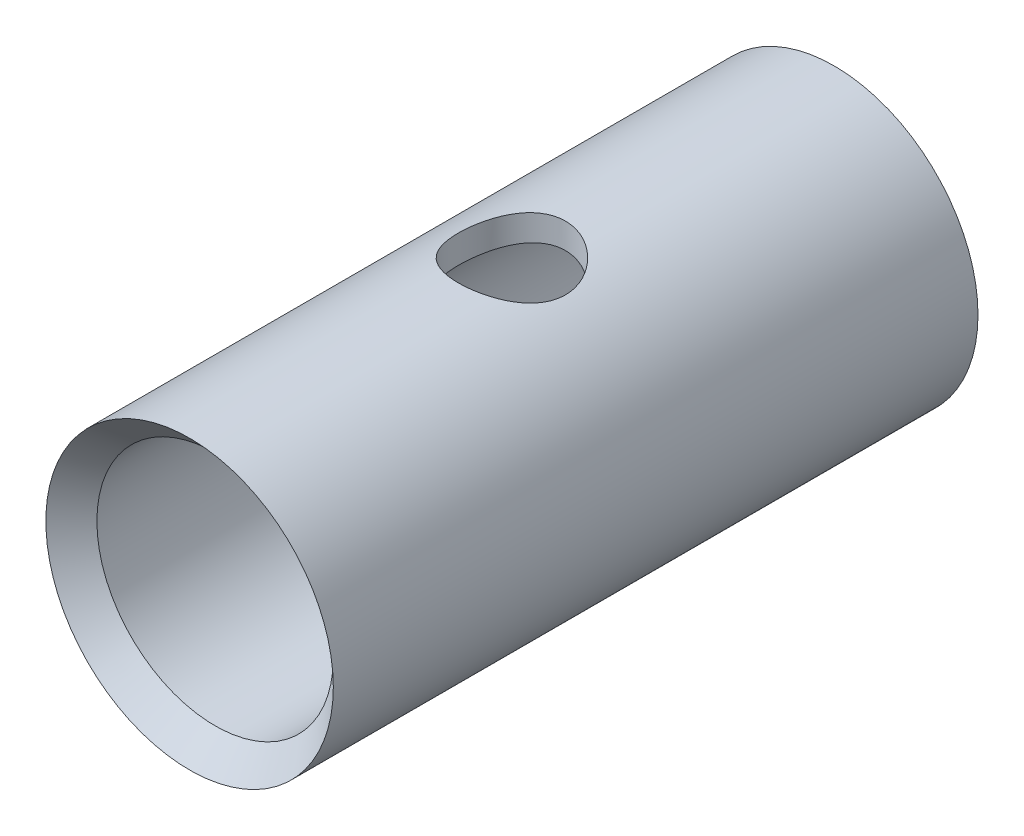
ISO-10303-21;
HEADER;
FILE_DESCRIPTION(('STEP AP214'),'2;1');
FILE_NAME('part.step','',(''),(''),'','','');
FILE_SCHEMA(('AUTOMOTIVE_DESIGN { 1 0 10303 214 1 1 1 1 }'));
ENDSEC;
DATA;
#1=APPLICATION_CONTEXT('core data for automotive mechanical design processes');
#2=APPLICATION_PROTOCOL_DEFINITION('international standard','automotive_design',2000,#1);
#3=PRODUCT_CONTEXT('',#1,'mechanical');
#4=PRODUCT('Part','Part','',(#3));
#5=PRODUCT_RELATED_PRODUCT_CATEGORY('part','',(#4));
#6=PRODUCT_DEFINITION_FORMATION('','',#4);
#7=PRODUCT_DEFINITION_CONTEXT('part definition',#1,'design');
#8=PRODUCT_DEFINITION('design','',#6,#7);
#9=PRODUCT_DEFINITION_SHAPE('','',#8);
#10=(LENGTH_UNIT() NAMED_UNIT(*) SI_UNIT(.MILLI.,.METRE.));
#11=(NAMED_UNIT(*) PLANE_ANGLE_UNIT() SI_UNIT($,.RADIAN.));
#12=(NAMED_UNIT(*) SI_UNIT($,.STERADIAN.) SOLID_ANGLE_UNIT());
#13=UNCERTAINTY_MEASURE_WITH_UNIT(LENGTH_MEASURE(1.E-05),#10,'distance_accuracy_value','');
#14=(GEOMETRIC_REPRESENTATION_CONTEXT(3) GLOBAL_UNCERTAINTY_ASSIGNED_CONTEXT((#13)) GLOBAL_UNIT_ASSIGNED_CONTEXT((#10,
#11,#12)) REPRESENTATION_CONTEXT('',''));
#15=CARTESIAN_POINT('',(0.,0.,0.));
#16=DIRECTION('',(0.,0.,1.));
#17=DIRECTION('',(1.,0.,0.));
#18=AXIS2_PLACEMENT_3D('',#15,#16,#17);
#19=CARTESIAN_POINT('',(0.,0.,37.9));
#20=DIRECTION('',(0.,0.,-1.));
#21=DIRECTION('',(-1.,0.,0.));
#22=AXIS2_PLACEMENT_3D('',#19,#20,#21);
#23=CYLINDRICAL_SURFACE('',#22,16.9);
#24=CARTESIAN_POINT('',(0.,16.9,6.3));
#25=CARTESIAN_POINT('',(-0.170621168013646,16.9000005495255,6.30000075229979));
#26=CARTESIAN_POINT('',(-0.341231905718225,16.8974105634237,6.29306339765766));
#27=CARTESIAN_POINT('',(-0.681236562405918,16.8871207820205,6.26538229568174));
#28=CARTESIAN_POINT('',(-0.850630047616662,16.8794192484132,6.24463385154478));
#29=CARTESIAN_POINT('',(-1.18679747227653,16.8591179028863,6.18954843388442));
#30=CARTESIAN_POINT('',(-1.35357274835379,16.8465206808765,6.15521864497196));
#31=CARTESIAN_POINT('',(-1.68347849426379,16.8167578248736,6.07328575068739));
#32=CARTESIAN_POINT('',(-1.84660752168567,16.7995904164659,6.02567748949004));
#33=CARTESIAN_POINT('',(-2.16767537294611,16.7611833077502,5.91775304746544));
#34=CARTESIAN_POINT('',(-2.32562546063216,16.7399532418655,5.85746689891143));
#35=CARTESIAN_POINT('',(-2.63579350467232,16.6939266086243,5.72460208101528));
#36=CARTESIAN_POINT('',(-2.78800931016346,16.6691287194992,5.65201885420729));
#37=CARTESIAN_POINT('',(-3.08571899465927,16.6165936824224,5.49514741364249));
#38=CARTESIAN_POINT('',(-3.23121388205003,16.5888569774721,5.41086096345324));
#39=CARTESIAN_POINT('',(-3.51473842709239,16.5311087146713,5.23113731919624));
#40=CARTESIAN_POINT('',(-3.6527653643097,16.50109633727,5.13569610113537));
#41=CARTESIAN_POINT('',(-3.92561005398422,16.4383671214281,4.93049811152152));
#42=CARTESIAN_POINT('',(-4.06011025041513,16.4055909683688,4.82033708767414));
#43=CARTESIAN_POINT('',(-4.3194459659585,16.3392259897144,4.58939391893625));
#44=CARTESIAN_POINT('',(-4.44428120665652,16.305637140745,4.46861146829253));
#45=CARTESIAN_POINT('',(-4.68362175921436,16.2385080694037,4.21708870220941));
#46=CARTESIAN_POINT('',(-4.79812232272719,16.2049678762807,4.08634385983885));
#47=CARTESIAN_POINT('',(-5.01600286755679,16.1388560588966,3.81574110252527));
#48=CARTESIAN_POINT('',(-5.11938659611052,16.1062841109573,3.6758862840384));
#49=CARTESIAN_POINT('',(-5.31812475084001,16.0417853857861,3.38232881986174));
#50=CARTESIAN_POINT('',(-5.41302406579179,16.0099302987466,3.22830176323067));
#51=CARTESIAN_POINT('',(-5.58940536606466,15.9492084036354,2.91226389501302));
#52=CARTESIAN_POINT('',(-5.6708927268506,15.920340400082,2.75025631598511));
#53=CARTESIAN_POINT('',(-5.81980942101562,15.8665085181469,2.41924696276032));
#54=CARTESIAN_POINT('',(-5.88723706164311,15.8415451099579,2.25024434931289));
#55=CARTESIAN_POINT('',(-6.00734722079026,15.79638884205,1.90654103845655));
#56=CARTESIAN_POINT('',(-6.06003682868019,15.7761936894095,1.73184312594368));
#57=CARTESIAN_POINT('',(-6.14834203709004,15.7419834333421,1.38513285493304));
#58=CARTESIAN_POINT('',(-6.18455895410029,15.7277524962012,1.21329493554901));
#59=CARTESIAN_POINT('',(-6.24253949028409,15.7048297117606,0.866903195015808));
#60=CARTESIAN_POINT('',(-6.26430941300662,15.6961354487522,0.692350592413399));
#61=CARTESIAN_POINT('',(-6.29317407342909,15.6845848821698,0.341868189277755));
#62=CARTESIAN_POINT('',(-6.30027093619383,15.6817277332211,0.165938591876598));
#63=CARTESIAN_POINT('',(-6.29971326789152,15.6819518669563,-0.185889958429555));
#64=CARTESIAN_POINT('',(-6.29205929959284,15.685032923088,-0.361788912247602));
#65=CARTESIAN_POINT('',(-6.26298083563819,15.6966650714368,-0.701731281724682));
#66=CARTESIAN_POINT('',(-6.24239982194643,15.7048809661134,-0.865859199475245));
#67=CARTESIAN_POINT('',(-6.18846142072574,15.7262133319127,-1.1917337553841));
#68=CARTESIAN_POINT('',(-6.15509978679452,15.7393314317735,-1.35347958351748));
#69=CARTESIAN_POINT('',(-6.07592473598682,15.7700646132966,-1.67340646056008));
#70=CARTESIAN_POINT('',(-6.03011455624527,15.7876785257901,-1.83158842465659));
#71=CARTESIAN_POINT('',(-5.92641928170079,15.8268956225991,-2.14349630241259));
#72=CARTESIAN_POINT('',(-5.86852956995387,15.8485003318821,-2.29722048659227));
#73=CARTESIAN_POINT('',(-5.73997571940507,15.8955165279266,-2.60202578724681));
#74=CARTESIAN_POINT('',(-5.66909631551509,15.9209906924915,-2.75300637079496));
#75=CARTESIAN_POINT('',(-5.51580925919303,15.9747439327848,-3.04853543199206));
#76=CARTESIAN_POINT('',(-5.43339768750958,16.003023961142,-3.1930817008085));
#77=CARTESIAN_POINT('',(-5.25761056369151,16.0616348172727,-3.47492719040059));
#78=CARTESIAN_POINT('',(-5.16423380704993,16.0919658701923,-3.61222561260686));
#79=CARTESIAN_POINT('',(-4.96709413933563,16.153905090977,-3.8788486790437));
#80=CARTESIAN_POINT('',(-4.8633307646408,16.185513315813,-4.00817296692023));
#81=CARTESIAN_POINT('',(-4.6387637276969,16.2513523859425,-4.2665065801102));
#82=CARTESIAN_POINT('',(-4.51728546497176,16.2856177143405,-4.39492148847767));
#83=CARTESIAN_POINT('',(-4.26395985965752,16.3537715347372,-4.64110255701562));
#84=CARTESIAN_POINT('',(-4.13211568069296,16.3876601381342,-4.75887194273811));
#85=CARTESIAN_POINT('',(-3.85872870626401,16.4541791219461,-4.98311994756249));
#86=CARTESIAN_POINT('',(-3.71718081527205,16.4868088270266,-5.08959255867709));
#87=CARTESIAN_POINT('',(-3.42534900798332,16.5499020826645,-5.29040106990669));
#88=CARTESIAN_POINT('',(-3.27506860728443,16.5803664941098,-5.38474180568226));
#89=CARTESIAN_POINT('',(-2.96423215771626,16.6387715408498,-5.56199896763376));
#90=CARTESIAN_POINT('',(-2.80355232547099,16.6666653568901,-5.64471407303524));
#91=CARTESIAN_POINT('',(-2.47521994258615,16.7185793381941,-5.79620212055356));
#92=CARTESIAN_POINT('',(-2.30757018700197,16.742601037748,-5.86498058772452));
#93=CARTESIAN_POINT('',(-1.96646075877162,16.7860830927623,-5.98797935824775));
#94=CARTESIAN_POINT('',(-1.79300194973094,16.8055441228265,-6.04220181486445));
#95=CARTESIAN_POINT('',(-1.44157945945188,16.8393289354646,-6.13554358845206));
#96=CARTESIAN_POINT('',(-1.26361604493125,16.8536530214389,-6.17466379740856));
#97=CARTESIAN_POINT('',(-0.914075290767235,16.8761223925919,-6.2357250816541));
#98=CARTESIAN_POINT('',(-0.74265502091892,16.8845532766444,-6.25846217302362));
#99=CARTESIAN_POINT('',(-0.398351442297092,16.8961824206641,-6.28976894738468));
#100=CARTESIAN_POINT('',(-0.225468194127639,16.8993808963283,-6.29833921437894));
#101=CARTESIAN_POINT('',(0.120399989853772,16.900455799623,-6.30122270947712));
#102=CARTESIAN_POINT('',(0.293384900254129,16.8983332335502,-6.29553863331205));
#103=CARTESIAN_POINT('',(0.638155088316055,16.8888275416577,-6.26997899429614));
#104=CARTESIAN_POINT('',(0.809940383820353,16.8814444942499,-6.25010364297821));
#105=CARTESIAN_POINT('',(1.14450128279663,16.8620022712354,-6.19739412985697));
#106=CARTESIAN_POINT('',(1.30737068189106,16.8501321124307,-6.16508293404881));
#107=CARTESIAN_POINT('',(1.62974833286344,16.8220126350691,-6.08780782267223));
#108=CARTESIAN_POINT('',(1.78925545814379,16.8057618730822,-6.04283973638109));
#109=CARTESIAN_POINT('',(2.10377857952379,16.7692926465133,-5.940660836668));
#110=CARTESIAN_POINT('',(2.25879578421814,16.7490752612729,-5.88345335327629));
#111=CARTESIAN_POINT('',(2.56349754307563,16.7051544723797,-5.75722906103647));
#112=CARTESIAN_POINT('',(2.7131800471032,16.6814497461036,-5.68820777000443));
#113=CARTESIAN_POINT('',(3.01052803784591,16.6303977595915,-5.53672823505879));
#114=CARTESIAN_POINT('',(3.15801047984873,16.6029650846885,-5.45393954386419));
#115=CARTESIAN_POINT('',(3.44555895098632,16.545683014114,-5.27699102049225));
#116=CARTESIAN_POINT('',(3.58562240781198,16.5158327891853,-5.1828272810055));
#117=CARTESIAN_POINT('',(3.85753220496953,16.4544485170715,-4.98375766240632));
#118=CARTESIAN_POINT('',(3.98937735673048,16.4229142275478,-4.87885023526176));
#119=CARTESIAN_POINT('',(4.24412514234555,16.3589319163027,-4.65893968682675));
#120=CARTESIAN_POINT('',(4.36702745452576,16.3264838617712,-4.54393620270916));
#121=CARTESIAN_POINT('',(4.61002992069146,16.2595943112867,-4.29758710332736));
#122=CARTESIAN_POINT('',(4.72956146417505,16.2251455909822,-4.16568183650315));
#123=CARTESIAN_POINT('',(4.9570956452551,16.1570821588875,-3.89215124981191));
#124=CARTESIAN_POINT('',(5.06510197327663,16.1234671827909,-3.75052906535413));
#125=CARTESIAN_POINT('',(5.26896215469136,16.0580044835236,-3.45829321053491));
#126=CARTESIAN_POINT('',(5.36480996658997,16.0261576433143,-3.30767512440993));
#127=CARTESIAN_POINT('',(5.54354893017009,15.9652116018421,-2.9984890176261));
#128=CARTESIAN_POINT('',(5.62644552884903,15.9361112475172,-2.83992437637628));
#129=CARTESIAN_POINT('',(5.77897583313075,15.8814367993584,-2.51510728621974));
#130=CARTESIAN_POINT('',(5.8485519998778,15.8558781297498,-2.34882517617697));
#131=CARTESIAN_POINT('',(5.97333691077132,15.8092911037657,-2.01041129278817));
#132=CARTESIAN_POINT('',(6.0285516653825,15.7882608528162,-1.83828200078615));
#133=CARTESIAN_POINT('',(6.12407361068238,15.7514553617766,-1.48943476950954));
#134=CARTESIAN_POINT('',(6.16438521236666,15.7356785669203,-1.31271820456311));
#135=CARTESIAN_POINT('',(6.22967178864632,15.7099467418598,-0.95605923196206));
#136=CARTESIAN_POINT('',(6.25464781521971,15.6999913123284,-0.77611704644778));
#137=CARTESIAN_POINT('',(6.28787989818049,15.6867097020635,-0.426019076306181));
#138=CARTESIAN_POINT('',(6.29709799540585,15.6830022980239,-0.255968423890921));
#139=CARTESIAN_POINT('',(6.30173317812632,15.6811404939853,0.0843494825246638));
#140=CARTESIAN_POINT('',(6.29715071399093,15.6829859127745,0.254616729275361));
#141=CARTESIAN_POINT('',(6.27423571586757,15.6921673654412,0.594054721342498));
#142=CARTESIAN_POINT('',(6.255904492561,15.6995028759432,0.763225569629114));
#143=CARTESIAN_POINT('',(6.20568730295427,15.7194202425393,1.09922709338117));
#144=CARTESIAN_POINT('',(6.17380134227905,15.7320020964563,1.2660577698177));
#145=CARTESIAN_POINT('',(6.09795452274454,15.7615529563653,1.59121957002708));
#146=CARTESIAN_POINT('',(6.05438546979896,15.7783787073944,1.74965543912415));
#147=CARTESIAN_POINT('',(5.95516730061994,15.8160929966394,2.06225251622011));
#148=CARTESIAN_POINT('',(5.89951420387523,15.8369828733511,2.21641229675051));
#149=CARTESIAN_POINT('',(5.77658782093709,15.8822327783029,2.51947637486521));
#150=CARTESIAN_POINT('',(5.70931628169858,15.9065922847514,2.66838145850051));
#151=CARTESIAN_POINT('',(5.56364074641075,15.9581286436169,2.96015652799162));
#152=CARTESIAN_POINT('',(5.48523272411245,15.985306514013,3.10302430679393));
#153=CARTESIAN_POINT('',(5.22542152465476,16.0729435614781,3.53579426358685));
#154=CARTESIAN_POINT('',(5.02573208561014,16.1370755843635,3.81424024778072));
#155=CARTESIAN_POINT('',(4.58427144385223,16.2679831571681,4.33485983733904));
#156=CARTESIAN_POINT('',(4.34248694731324,16.3347595370261,4.57702193898946));
#157=CARTESIAN_POINT('',(3.94563325234357,16.4335628609549,4.9147111667876));
#158=CARTESIAN_POINT('',(3.80361543993247,16.4670917745851,5.02543332275901));
#159=CARTESIAN_POINT('',(3.51032978967127,16.5320931427295,5.23449870446372));
#160=CARTESIAN_POINT('',(3.35906542969165,16.5635663613429,5.33284654245311));
#161=CARTESIAN_POINT('',(3.04814500961123,16.6235946259716,5.51646930711526));
#162=CARTESIAN_POINT('',(2.88848467398469,16.6521481629589,5.601737484881));
#163=CARTESIAN_POINT('',(2.56196843371789,16.705498050936,5.75839283700686));
#164=CARTESIAN_POINT('',(2.39511562819453,16.7302959997644,5.82978591829691));
#165=CARTESIAN_POINT('',(2.04875352068437,16.7763014133154,5.96055233029704));
#166=CARTESIAN_POINT('',(1.86900430138347,16.7973328878215,6.01935389408757));
#167=CARTESIAN_POINT('',(1.50441157260641,16.8339035649305,6.12066527150767));
#168=CARTESIAN_POINT('',(1.31956783312357,16.8494425191187,6.16317434827057));
#169=CARTESIAN_POINT('',(0.946477196300018,16.8745109857018,6.23138251903347));
#170=CARTESIAN_POINT('',(0.758231719065533,16.8840429487932,6.25708846843277));
#171=CARTESIAN_POINT('',(0.379986391707063,16.8967868150662,6.29139588363098));
#172=CARTESIAN_POINT('',(0.189986729671972,16.8999993881032,6.29999916231393));
#173=CARTESIAN_POINT('',(0.,16.9,6.3));
#174=B_SPLINE_CURVE_WITH_KNOTS('',3,(#24,#25,#26,#27,#28,#29,#30,#31,#32,#33,#34,#35,#36,#37,
#38,#39,#40,#41,#42,#43,#44,#45,#46,#47,#48,#49,#50,#51,#52,#53,#54,#55,#56,#57,#58,#59,#60,#61,
#62,#63,#64,#65,#66,#67,#68,#69,#70,#71,#72,#73,#74,#75,#76,#77,#78,#79,#80,#81,#82,#83,#84,#85,
#86,#87,#88,#89,#90,#91,#92,#93,#94,#95,#96,#97,#98,#99,#100,#101,#102,#103,#104,#105,#106,#107,
#108,#109,#110,#111,#112,#113,#114,#115,#116,#117,#118,#119,#120,#121,#122,#123,#124,#125,#126,
#127,#128,#129,#130,#131,#132,#133,#134,#135,#136,#137,#138,#139,#140,#141,#142,#143,#144,#145,
#146,#147,#148,#149,#150,#151,#152,#153,#154,#155,#156,#157,#158,#159,#160,#161,#162,#163,#164,
#165,#166,#167,#168,#169,#170,#171,#172,#173),.UNSPECIFIED.,.T.,.F.,(4,2,2,2,2,2,2,2,2,2,2,2,2,
2,2,2,2,2,2,2,2,2,2,2,2,2,2,2,2,2,2,2,2,2,2,2,2,2,2,2,2,2,2,2,2,2,2,2,2,2,2,2,2,2,2,2,2,2,2,2,2,
2,2,2,2,2,2,2,2,2,2,2,2,2,4),(0.,0.511685719119617,1.02354553860795,1.53513494255571,
2.04692326595268,2.55751261713712,3.06829161535466,3.57899372726423,4.08988064283557,
4.62004275321381,5.15022013007766,5.68063987403637,6.21088026113594,6.76129352798836,
7.31148565105759,7.86174397754394,8.41173715873816,8.93961676211489,9.46726588802973,
9.99483859040696,10.5223911654199,11.0186607860346,11.5150954370371,12.0114011179026,
12.5078968414419,13.0135194470691,13.5193143097091,14.0251647851214,14.5310378499972,
15.0705967195231,15.609991552937,16.1496718308821,16.6891363257498,17.2370218274591,
17.7846896981245,18.3322765078155,18.8798309703804,19.3985576635092,19.9172629724977,
20.4358701931686,20.9544696837234,21.4532967728799,21.9522884293197,22.4511444950137,
22.9501902490119,23.4636460994575,23.9772788253109,24.4909856636743,25.0047109709456,
25.548010065938,26.0911346687982,26.6345280986399,27.1776923702507,27.7231524202234,
28.268383818387,28.8134537109687,29.3584862090859,29.8688676080478,30.3792323513304,
30.8895484472733,31.3998643314459,31.8948393102601,32.3899775829698,32.8850414711488,
33.3802848009278,34.4212535258371,35.4625515920712,36.0115099089436,36.5602630036436,
37.1092983010368,37.6580993477003,38.2281289182838,38.7981842667762,39.368006896672,
39.9377691221165),.UNSPECIFIED.);
#175=CARTESIAN_POINT('',(0.,16.9,6.3));
#176=VERTEX_POINT('',#175);
#177=EDGE_CURVE('E58',#176,#176,#174,.T.);
#178=ORIENTED_EDGE('',*,*,#177,.T.);
#179=EDGE_LOOP('',(#178));
#180=FACE_BOUND('',#179,.T.);
#181=CARTESIAN_POINT('',(0.,0.,37.9));
#182=DIRECTION('',(0.,0.,1.));
#183=DIRECTION('',(1.,0.,0.));
#184=AXIS2_PLACEMENT_3D('',#181,#182,#183);
#185=CIRCLE('',#184,16.9);
#186=CARTESIAN_POINT('',(16.9,0.,37.9));
#187=VERTEX_POINT('',#186);
#188=EDGE_CURVE('E43',#187,#187,#185,.T.);
#189=ORIENTED_EDGE('',*,*,#188,.F.);
#190=EDGE_LOOP('',(#189));
#191=FACE_BOUND('',#190,.T.);
#192=CARTESIAN_POINT('',(0.,0.,-37.9));
#193=DIRECTION('',(0.,0.,1.));
#194=DIRECTION('',(1.,0.,0.));
#195=AXIS2_PLACEMENT_3D('',#192,#193,#194);
#196=CIRCLE('',#195,16.9);
#197=CARTESIAN_POINT('',(16.9,0.,-37.9));
#198=VERTEX_POINT('',#197);
#199=EDGE_CURVE('E47',#198,#198,#196,.T.);
#200=ORIENTED_EDGE('',*,*,#199,.T.);
#201=EDGE_LOOP('',(#200));
#202=FACE_BOUND('',#201,.T.);
#203=ADVANCED_FACE('F32',(#180,#191,#202),#23,.T.);
#204=CARTESIAN_POINT('',(0.,0.,37.9));
#205=DIRECTION('',(0.,0.,-1.));
#206=DIRECTION('',(-1.,0.,0.));
#207=AXIS2_PLACEMENT_3D('',#204,#205,#206);
#208=CYLINDRICAL_SURFACE('',#207,13.9);
#209=CARTESIAN_POINT('',(0.,0.,-34.9));
#210=DIRECTION('',(0.,0.,1.));
#211=DIRECTION('',(1.,0.,0.));
#212=AXIS2_PLACEMENT_3D('',#209,#210,#211);
#213=CIRCLE('',#212,13.9);
#214=CARTESIAN_POINT('',(13.9,0.,-34.9));
#215=VERTEX_POINT('',#214);
#216=EDGE_CURVE('E10',#215,#215,#213,.F.);
#217=ORIENTED_EDGE('',*,*,#216,.T.);
#218=EDGE_LOOP('',(#217));
#219=FACE_BOUND('',#218,.T.);
#220=CARTESIAN_POINT('',(0.,0.,34.9));
#221=DIRECTION('',(0.,0.,1.));
#222=DIRECTION('',(1.,0.,0.));
#223=AXIS2_PLACEMENT_3D('',#220,#221,#222);
#224=CIRCLE('',#223,13.9);
#225=CARTESIAN_POINT('',(13.9,0.,34.9));
#226=VERTEX_POINT('',#225);
#227=EDGE_CURVE('E39',#226,#226,#224,.T.);
#228=ORIENTED_EDGE('',*,*,#227,.T.);
#229=EDGE_LOOP('',(#228));
#230=FACE_BOUND('',#229,.T.);
#231=CARTESIAN_POINT('',(0.,13.9,6.3));
#232=CARTESIAN_POINT('',(-0.167480490539599,13.8999989585756,6.29999876901717));
#233=CARTESIAN_POINT('',(-0.334999038836244,13.8969652011824,6.29331291265054));
#234=CARTESIAN_POINT('',(-0.668826059200423,13.8849054197376,6.26663673665051));
#235=CARTESIAN_POINT('',(-0.835133813615113,13.8758760946877,6.24663908788684));
#236=CARTESIAN_POINT('',(-1.16552961381155,13.8520402712317,6.19351147146286));
#237=CARTESIAN_POINT('',(-1.32961309181937,13.8372233350149,6.16035777547527));
#238=CARTESIAN_POINT('',(-1.65414213790531,13.8021906373909,6.08125995817146));
#239=CARTESIAN_POINT('',(-1.8145861896502,13.7819726689433,6.03531060780132));
#240=CARTESIAN_POINT('',(-2.13005938862995,13.7367440828614,5.93130009506076));
#241=CARTESIAN_POINT('',(-2.28510791103515,13.7117532992795,5.87328897143582));
#242=CARTESIAN_POINT('',(-2.58958855770939,13.6575238988198,5.74554635510182));
#243=CARTESIAN_POINT('',(-2.73901855076056,13.6282836901102,5.6758104687621));
#244=CARTESIAN_POINT('',(-3.03128895784122,13.5662663389925,5.52524087812586));
#245=CARTESIAN_POINT('',(-3.17413355129067,13.5334914852144,5.44441434573259));
#246=CARTESIAN_POINT('',(-3.4526313885897,13.4651378588917,5.27220762445501));
#247=CARTESIAN_POINT('',(-3.5882819858689,13.4295580662554,5.18082359037418));
#248=CARTESIAN_POINT('',(-3.99711889117816,13.315987841625,4.88168183281542));
#249=CARTESIAN_POINT('',(-4.25702168951584,13.234494386139,4.65671709587854));
#250=CARTESIAN_POINT('',(-4.73687211698742,13.0704457288385,4.16767377764092));
#251=CARTESIAN_POINT('',(-4.95679497235315,12.9878899024137,3.90357112705708));
#252=CARTESIAN_POINT('',(-5.25889558719907,12.8672750835803,3.47379381116566));
#253=CARTESIAN_POINT('',(-5.35729646058136,12.8265084856375,3.32005934310775));
#254=CARTESIAN_POINT('',(-5.54069303450717,12.7483585711862,3.00400778110838));
#255=CARTESIAN_POINT('',(-5.62569435038467,12.7109738402573,2.84169432063597));
#256=CARTESIAN_POINT('',(-5.78155157879331,12.6408454300553,2.50944951142341));
#257=CARTESIAN_POINT('',(-5.852407600718,12.6081017148911,2.33951822160868));
#258=CARTESIAN_POINT('',(-5.97920052929545,12.548468978725,1.99326945835126));
#259=CARTESIAN_POINT('',(-6.03514557985334,12.5215767632972,1.81695553092218));
#260=CARTESIAN_POINT('',(-6.12889878113492,12.4759437679967,1.4687898305808));
#261=CARTESIAN_POINT('',(-6.16751643276787,12.4568441600219,1.29720316446527));
#262=CARTESIAN_POINT('',(-6.23031419765025,12.4255551549695,0.950861708418513));
#263=CARTESIAN_POINT('',(-6.25450136395005,12.4133623822515,0.776108509269212));
#264=CARTESIAN_POINT('',(-6.28812942130905,12.3963617795176,0.424896481956854));
#265=CARTESIAN_POINT('',(-6.29757594795819,12.3915511272069,0.24843833159933));
#266=CARTESIAN_POINT('',(-6.30160399202906,12.3895034276897,-0.104685625431695));
#267=CARTESIAN_POINT('',(-6.29618652631172,12.3922658624007,-0.281351417073773));
#268=CARTESIAN_POINT('',(-6.27177749426513,12.4046348397629,-0.616732588624386));
#269=CARTESIAN_POINT('',(-6.2541124839192,12.4135722539689,-0.77557143555386));
#270=CARTESIAN_POINT('',(-6.20685211176091,12.4372700125066,-1.0910729732269));
#271=CARTESIAN_POINT('',(-6.17725291092436,12.4520322305449,-1.24773494691627));
#272=CARTESIAN_POINT('',(-6.10644081346089,12.4869105795743,-1.55777186809299));
#273=CARTESIAN_POINT('',(-6.06523014754557,12.5070256821663,-1.71114744085613));
#274=CARTESIAN_POINT('',(-5.97159603957414,12.5520009417231,-2.01374388225459));
#275=CARTESIAN_POINT('',(-5.91916824078314,12.5768629419783,-2.16296311104195));
#276=CARTESIAN_POINT('',(-5.74312068093274,12.6587373571735,-2.6096632608111));
#277=CARTESIAN_POINT('',(-5.60229666558918,12.7222285830338,-2.89938724208016));
#278=CARTESIAN_POINT('',(-5.27967988397758,12.8594560034851,-3.45219418035896));
#279=CARTESIAN_POINT('',(-5.09786958330453,12.9331965776727,-3.71526566510132));
#280=CARTESIAN_POINT('',(-4.67678611832851,13.0917256414585,-4.2356556883385));
#281=CARTESIAN_POINT('',(-4.43354861009018,13.1768748560965,-4.48966587454011));
#282=CARTESIAN_POINT('',(-3.90707456096675,13.3424389544922,-4.9545919061205));
#283=CARTESIAN_POINT('',(-3.62382501075868,13.422852286351,-5.16549368064757));
#284=CARTESIAN_POINT('',(-3.16912532492745,13.5348524073585,-5.44793182936305));
#285=CARTESIAN_POINT('',(-3.0098294794693,13.5712495983419,-5.53755101237802));
#286=CARTESIAN_POINT('',(-2.68330047455459,13.6395620650092,-5.70292368241851));
#287=CARTESIAN_POINT('',(-2.51607063233829,13.6714791921135,-5.7786829011296));
#288=CARTESIAN_POINT('',(-2.17486790598765,13.7298911327729,-5.91555053409128));
#289=CARTESIAN_POINT('',(-2.00089709522139,13.7563875980988,-5.97666341231534));
#290=CARTESIAN_POINT('',(-1.64749627667748,13.8031701960188,-6.08356982781327));
#291=CARTESIAN_POINT('',(-1.46806677286051,13.8234569000129,-6.12936477462407));
#292=CARTESIAN_POINT('',(-1.11833476447837,13.8559704413541,-6.20233034298068));
#293=CARTESIAN_POINT('',(-0.948306160888809,13.8686726939458,-6.23060514965987));
#294=CARTESIAN_POINT('',(-0.606159853187639,13.8878334877113,-6.27313970585812));
#295=CARTESIAN_POINT('',(-0.434042292089914,13.8942924538976,-6.28740040939029));
#296=CARTESIAN_POINT('',(-0.0891479979302745,13.9007839432597,-6.30173267920769));
#297=CARTESIAN_POINT('',(0.0836285249855215,13.9008183676829,-6.30180844331441));
#298=CARTESIAN_POINT('',(0.428482971601934,13.8944643582631,-6.28778018440577));
#299=CARTESIAN_POINT('',(0.600560916366052,13.888076119542,-6.27367659216238));
#300=CARTESIAN_POINT('',(0.932151961884585,13.8696417252658,-6.23275782584496));
#301=CARTESIAN_POINT('',(1.09178923037146,13.8579659829671,-6.20677392241093));
#302=CARTESIAN_POINT('',(1.40819734814506,13.8293969667559,-6.14272271144645));
#303=CARTESIAN_POINT('',(1.56496725733791,13.8125020130348,-6.10465151349829));
#304=CARTESIAN_POINT('',(1.87453156945305,13.7739049264369,-6.01681076727168));
#305=CARTESIAN_POINT('',(2.02732712129434,13.7522042004805,-5.96704464249715));
#306=CARTESIAN_POINT('',(2.32813549142829,13.7044879789781,-5.85623516626263));
#307=CARTESIAN_POINT('',(2.47614645780731,13.6784708360646,-5.79518750817041));
#308=CARTESIAN_POINT('',(2.77097555465421,13.6218538984269,-5.66027992784721));
#309=CARTESIAN_POINT('',(2.91761812797853,13.5911381005175,-5.58608470177316));
#310=CARTESIAN_POINT('',(3.2041496423349,13.5264569144111,-5.4268149792406));
#311=CARTESIAN_POINT('',(3.34403607652651,13.4924903337511,-5.34173648666355));
#312=CARTESIAN_POINT('',(3.75246853731611,13.3868549408335,-5.07105368482783));
#313=CARTESIAN_POINT('',(4.0099469545432,13.3114186290913,-4.86992870203611));
#314=CARTESIAN_POINT('',(4.5103620665511,13.150720243262,-4.41258553802632));
#315=CARTESIAN_POINT('',(4.75029113026908,13.0651635918677,-4.15317004391674));
#316=CARTESIAN_POINT('',(5.07561968858824,12.9406972623035,-3.73621097567993));
#317=CARTESIAN_POINT('',(5.17836417511373,12.8998247835484,-3.59246996694156));
#318=CARTESIAN_POINT('',(5.37167750679676,12.8205294232993,-3.29640661321657));
#319=CARTESIAN_POINT('',(5.46225112017847,12.7821055856131,-3.14408766222428));
#320=CARTESIAN_POINT('',(5.6328596313912,12.7078635079019,-2.82738966705084));
#321=CARTESIAN_POINT('',(5.7125371544574,12.6721456952273,-2.66279438428412));
#322=CARTESIAN_POINT('',(5.85755350947147,12.6057696071089,-2.32649434681213));
#323=CARTESIAN_POINT('',(5.92289871944372,12.5751090826332,-2.15479279507046));
#324=CARTESIAN_POINT('',(6.03853172983902,12.5199936587341,-1.80553315393643));
#325=CARTESIAN_POINT('',(6.08882888477815,12.4955349054722,-1.62797877944956));
#326=CARTESIAN_POINT('',(6.17376991864666,12.453787141283,-1.26834140124377));
#327=CARTESIAN_POINT('',(6.20841566602324,12.4364972745626,-1.08625894082211));
#328=CARTESIAN_POINT('',(6.25924933698561,12.4109842282394,-0.735165955453715));
#329=CARTESIAN_POINT('',(6.27678116498955,12.4021029640239,-0.566396814686546));
#330=CARTESIAN_POINT('',(6.29816570887935,12.3912572589315,-0.22777641591825));
#331=CARTESIAN_POINT('',(6.30201937648757,12.3892923368176,-0.0579252340290981));
#332=CARTESIAN_POINT('',(6.29599809766037,12.3923532042203,0.281432999652699));
#333=CARTESIAN_POINT('',(6.28612593276665,12.3973775773554,0.45094011419993));
#334=CARTESIAN_POINT('',(6.252788232366,12.4142251835925,0.788265905590706));
#335=CARTESIAN_POINT('',(6.22932295034883,12.426048289909,0.95608461386094));
#336=CARTESIAN_POINT('',(6.17106523510552,12.4550766607167,1.27785673053445));
#337=CARTESIAN_POINT('',(6.13711278101897,12.4718799312787,1.43199980449761));
#338=CARTESIAN_POINT('',(6.05792587111449,12.5105345292341,1.73675898675825));
#339=CARTESIAN_POINT('',(6.01268782837883,12.5323874614068,1.88737395703205));
#340=CARTESIAN_POINT('',(5.91134860818969,12.5805047471802,2.18415586133305));
#341=CARTESIAN_POINT('',(5.85524884791603,12.6067685252177,2.33032337276545));
#342=CARTESIAN_POINT('',(5.73263188915852,12.662996412804,2.61750645888493));
#343=CARTESIAN_POINT('',(5.66611087366434,12.6929618773218,2.75852012243143));
#344=CARTESIAN_POINT('',(5.44235156834897,12.7913442856906,3.19066153720368));
#345=CARTESIAN_POINT('',(5.26743326066536,12.8650026027652,3.47166956429368));
#346=CARTESIAN_POINT('',(4.87675959304616,13.0181067781723,4.00197422111557));
#347=CARTESIAN_POINT('',(4.66098633977143,13.0975551629814,4.25125687571494));
#348=CARTESIAN_POINT('',(4.29929022365924,13.219090613762,4.60851679236362));
#349=CARTESIAN_POINT('',(4.16602874956824,13.2617919436988,4.72933352466752));
#350=CARTESIAN_POINT('',(3.88937419115739,13.3455469590064,4.95934458329875));
#351=CARTESIAN_POINT('',(3.745984632773,13.3866012100538,5.06854292153128));
#352=CARTESIAN_POINT('',(3.44971984960776,13.46599339715,5.2746595342432));
#353=CARTESIAN_POINT('',(3.29683587813042,13.5043287566587,5.37156622739929));
#354=CARTESIAN_POINT('',(2.98266758280707,13.5771748260025,5.55216190437703));
#355=CARTESIAN_POINT('',(2.82138719047286,13.6116873025911,5.63585700163234));
#356=CARTESIAN_POINT('',(2.49282106984732,13.6756576158507,5.78864268239259));
#357=CARTESIAN_POINT('',(2.32559894606005,13.7051563852858,5.85785272008393));
#358=CARTESIAN_POINT('',(1.98510091787683,13.7585991244672,5.98182070011531));
#359=CARTESIAN_POINT('',(1.81182798580632,13.7825457786027,6.03658562828381));
#360=CARTESIAN_POINT('',(1.46091210676018,13.8241413179368,6.13096023989422));
#361=CARTESIAN_POINT('',(1.28328055166229,13.8418050677934,6.17060571057597));
#362=CARTESIAN_POINT('',(0.92481013805473,13.8703643809513,6.23440680640483));
#363=CARTESIAN_POINT('',(0.74397355371001,13.8812645600789,6.2585729958148));
#364=CARTESIAN_POINT('',(0.468908811425735,13.8924040414389,6.28322655654245));
#365=CARTESIAN_POINT('',(0.375266462023894,13.8952499232482,6.28951379721549));
#366=CARTESIAN_POINT('',(0.187753396919955,13.8990482085359,6.29790089518345));
#367=CARTESIAN_POINT('',(0.0938826778334769,13.9000005837797,6.30000069003837));
#368=CARTESIAN_POINT('',(0.,13.9,6.3));
#369=B_SPLINE_CURVE_WITH_KNOTS('',3,(#231,#232,#233,#234,#235,#236,#237,#238,#239,#240,#241,
#242,#243,#244,#245,#246,#247,#248,#249,#250,#251,#252,#253,#254,#255,#256,#257,#258,#259,#260,
#261,#262,#263,#264,#265,#266,#267,#268,#269,#270,#271,#272,#273,#274,#275,#276,#277,#278,#279,
#280,#281,#282,#283,#284,#285,#286,#287,#288,#289,#290,#291,#292,#293,#294,#295,#296,#297,#298,
#299,#300,#301,#302,#303,#304,#305,#306,#307,#308,#309,#310,#311,#312,#313,#314,#315,#316,#317,
#318,#319,#320,#321,#322,#323,#324,#325,#326,#327,#328,#329,#330,#331,#332,#333,#334,#335,#336,
#337,#338,#339,#340,#341,#342,#343,#344,#345,#346,#347,#348,#349,#350,#351,#352,#353,#354,#355,
#356,#357,#358,#359,#360,#361,#362,#363,#364,#365,#366,#367,#368),.UNSPECIFIED.,.T.,.F.,(4,2,2,
2,2,2,2,2,2,2,2,2,2,2,2,2,2,2,2,2,2,2,2,2,2,2,2,2,2,2,2,2,2,2,2,2,2,2,2,2,2,2,2,2,2,2,2,2,2,2,2,
2,2,2,2,2,2,2,2,2,2,2,2,2,2,2,2,2,4),(0.,0.502347546633975,1.00497190190968,1.50850694418864,
2.01224806311996,2.51393966076046,3.01581967846851,3.51737666549153,4.01911690624731,
5.07412661272337,6.12978784921449,6.69026874828834,7.25051413939698,7.81075519764374,
8.37068963983407,8.90069958552803,9.43045027065821,9.95999837368879,10.4895102506944,
10.9691492539099,11.4489426720149,11.9286439784154,12.4085319401533,13.3891369666511,
14.3701623060886,15.4509969541031,16.5321838318237,17.0906607279131,17.6489061453686,
18.2069812014326,18.7650048899897,19.2828214246337,19.8006027063622,20.3182307581921,
20.8358430848424,21.3217596955927,21.8078328623274,22.2937639157306,22.7798808539375,
23.2808949980545,23.7820936354783,24.7839622667102,25.8694554676343,26.412997790479,
26.95632654317,27.514564050528,28.0725526302334,28.6301936161282,29.1877680138747,
29.6968196479236,30.2058358616153,30.7147489381403,31.2236525245607,31.6993155807242,
32.1751300107198,32.6508824007354,33.1268094545344,34.1396527097608,35.1529405928107,
35.7070074919314,36.2608824430272,36.8152754446553,37.3694111538689,37.9187793825549,
38.4678814410108,39.0156756054992,39.5630955132742,39.8446866974472,40.1262820804624),.UNSPECIFIED.);
#370=CARTESIAN_POINT('',(0.,13.9,6.3));
#371=VERTEX_POINT('',#370);
#372=EDGE_CURVE('E50',#371,#371,#369,.T.);
#373=ORIENTED_EDGE('',*,*,#372,.F.);
#374=EDGE_LOOP('',(#373));
#375=FACE_BOUND('',#374,.T.);
#376=ADVANCED_FACE('F59',(#219,#230,#375),#208,.F.);
#377=CARTESIAN_POINT('',(0.,-3.89999999999995,0.));
#378=DIRECTION('',(0.,1.,0.));
#379=DIRECTION('',(0.,0.,1.));
#380=AXIS2_PLACEMENT_3D('',#377,#378,#379);
#381=CYLINDRICAL_SURFACE('',#380,6.3);
#382=ORIENTED_EDGE('',*,*,#372,.T.);
#383=EDGE_LOOP('',(#382));
#384=FACE_BOUND('',#383,.T.);
#385=ORIENTED_EDGE('',*,*,#177,.F.);
#386=EDGE_LOOP('',(#385));
#387=FACE_BOUND('',#386,.T.);
#388=ADVANCED_FACE('F62',(#384,#387),#381,.F.);
#389=CARTESIAN_POINT('',(0.,0.,-37.9));
#390=DIRECTION('',(0.,0.,-1.));
#391=DIRECTION('',(-1.,0.,0.));
#392=AXIS2_PLACEMENT_3D('',#389,#390,#391);
#393=CONICAL_SURFACE('',#392,16.9,0.785398163397445);
#394=ORIENTED_EDGE('',*,*,#216,.F.);
#395=EDGE_LOOP('',(#394));
#396=FACE_BOUND('',#395,.T.);
#397=ORIENTED_EDGE('',*,*,#199,.F.);
#398=EDGE_LOOP('',(#397));
#399=FACE_BOUND('',#398,.T.);
#400=ADVANCED_FACE('F65',(#396,#399),#393,.F.);
#401=CARTESIAN_POINT('',(0.,0.,34.9));
#402=DIRECTION('',(0.,0.,1.));
#403=DIRECTION('',(1.,0.,0.));
#404=AXIS2_PLACEMENT_3D('',#401,#402,#403);
#405=CONICAL_SURFACE('',#404,13.9,0.785398163397449);
#406=ORIENTED_EDGE('',*,*,#188,.T.);
#407=EDGE_LOOP('',(#406));
#408=FACE_BOUND('',#407,.T.);
#409=ORIENTED_EDGE('',*,*,#227,.F.);
#410=EDGE_LOOP('',(#409));
#411=FACE_BOUND('',#410,.T.);
#412=ADVANCED_FACE('F34',(#408,#411),#405,.F.);
#413=CLOSED_SHELL('',(#203,#376,#388,#400,#412));
#414=MANIFOLD_SOLID_BREP('B2',#413);
#415=ADVANCED_BREP_SHAPE_REPRESENTATION('',(#18,#414),#14);
#416=SHAPE_DEFINITION_REPRESENTATION(#9,#415);
ENDSEC;
END-ISO-10303-21;
